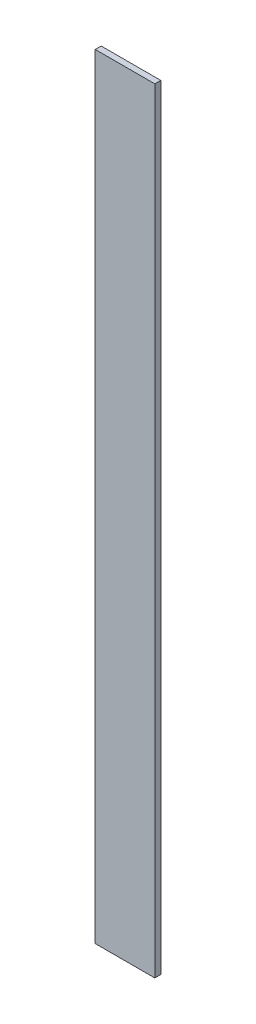
ISO-10303-21;
HEADER;
FILE_DESCRIPTION(('STEP AP214'),'2;1');
FILE_NAME('part.step','',(''),(''),'','','');
FILE_SCHEMA(('AUTOMOTIVE_DESIGN { 1 0 10303 214 1 1 1 1 }'));
ENDSEC;
DATA;
#1=APPLICATION_CONTEXT('core data for automotive mechanical design processes');
#2=APPLICATION_PROTOCOL_DEFINITION('international standard','automotive_design',2000,#1);
#3=PRODUCT_CONTEXT('',#1,'mechanical');
#4=PRODUCT('Part','Part','',(#3));
#5=PRODUCT_RELATED_PRODUCT_CATEGORY('part','',(#4));
#6=PRODUCT_DEFINITION_FORMATION('','',#4);
#7=PRODUCT_DEFINITION_CONTEXT('part definition',#1,'design');
#8=PRODUCT_DEFINITION('design','',#6,#7);
#9=PRODUCT_DEFINITION_SHAPE('','',#8);
#10=(LENGTH_UNIT() NAMED_UNIT(*) SI_UNIT(.MILLI.,.METRE.));
#11=(NAMED_UNIT(*) PLANE_ANGLE_UNIT() SI_UNIT($,.RADIAN.));
#12=(NAMED_UNIT(*) SI_UNIT($,.STERADIAN.) SOLID_ANGLE_UNIT());
#13=UNCERTAINTY_MEASURE_WITH_UNIT(LENGTH_MEASURE(1.E-05),#10,'distance_accuracy_value','');
#14=(GEOMETRIC_REPRESENTATION_CONTEXT(3) GLOBAL_UNCERTAINTY_ASSIGNED_CONTEXT((#13)) GLOBAL_UNIT_ASSIGNED_CONTEXT((#10,
#11,#12)) REPRESENTATION_CONTEXT('',''));
#15=CARTESIAN_POINT('',(0.,0.,0.));
#16=DIRECTION('',(0.,0.,1.));
#17=DIRECTION('',(1.,0.,0.));
#18=AXIS2_PLACEMENT_3D('',#15,#16,#17);
#19=CARTESIAN_POINT('',(-0.04999989999999,0.65000124,0.01));
#20=DIRECTION('',(0.,0.,-1.));
#21=DIRECTION('',(-1.,0.,0.));
#22=AXIS2_PLACEMENT_3D('',#19,#20,#21);
#23=PLANE('',#22);
#24=DIRECTION('',(1.,0.,0.));
#25=VECTOR('',#24,1.);
#26=CARTESIAN_POINT('',(-0.04999989999999,-0.6499987,0.01));
#27=LINE('',#26,#25);
#28=CARTESIAN_POINT('',(-0.04999989999999,-0.6499987,0.01));
#29=VERTEX_POINT('',#28);
#30=CARTESIAN_POINT('',(0.04999989999999,-0.6499987,0.01));
#31=VERTEX_POINT('',#30);
#32=EDGE_CURVE('E55',#29,#31,#27,.T.);
#33=ORIENTED_EDGE('',*,*,#32,.T.);
#34=DIRECTION('',(0.,1.,0.));
#35=VECTOR('',#34,1.);
#36=CARTESIAN_POINT('',(0.04999989999999,-0.6499987,0.01));
#37=LINE('',#36,#35);
#38=CARTESIAN_POINT('',(0.04999989999999,0.65000124,0.01));
#39=VERTEX_POINT('',#38);
#40=EDGE_CURVE('E57',#31,#39,#37,.T.);
#41=ORIENTED_EDGE('',*,*,#40,.T.);
#42=DIRECTION('',(1.,0.,0.));
#43=VECTOR('',#42,1.);
#44=CARTESIAN_POINT('',(0.04999989999999,0.65000124,0.01));
#45=LINE('',#44,#43);
#46=CARTESIAN_POINT('',(-0.04999989999999,0.65000124,0.01));
#47=VERTEX_POINT('',#46);
#48=EDGE_CURVE('E20',#39,#47,#45,.F.);
#49=ORIENTED_EDGE('',*,*,#48,.T.);
#50=DIRECTION('',(0.,1.,0.));
#51=VECTOR('',#50,1.);
#52=CARTESIAN_POINT('',(-0.04999989999999,0.65000124,0.01));
#53=LINE('',#52,#51);
#54=EDGE_CURVE('E80',#47,#29,#53,.F.);
#55=ORIENTED_EDGE('',*,*,#54,.T.);
#56=EDGE_LOOP('',(#33,#41,#49,#55));
#57=FACE_BOUND('',#56,.T.);
#58=ADVANCED_FACE('F17',(#57),#23,.F.);
#59=CARTESIAN_POINT('',(0.04999989999999,0.65000124,0.));
#60=DIRECTION('',(0.,-1.,0.));
#61=DIRECTION('',(0.,0.,-1.));
#62=AXIS2_PLACEMENT_3D('',#59,#60,#61);
#63=PLANE('',#62);
#64=DIRECTION('',(0.,0.,-1.));
#65=VECTOR('',#64,1.);
#66=CARTESIAN_POINT('',(-0.04999989999999,0.65000124,0.));
#67=LINE('',#66,#65);
#68=CARTESIAN_POINT('',(-0.04999989999999,0.65000124,0.));
#69=VERTEX_POINT('',#68);
#70=EDGE_CURVE('E68',#69,#47,#67,.F.);
#71=ORIENTED_EDGE('',*,*,#70,.T.);
#72=ORIENTED_EDGE('',*,*,#48,.F.);
#73=DIRECTION('',(0.,0.,1.));
#74=VECTOR('',#73,1.);
#75=CARTESIAN_POINT('',(0.04999989999999,0.65000124,0.));
#76=LINE('',#75,#74);
#77=CARTESIAN_POINT('',(0.04999989999999,0.65000124,0.));
#78=VERTEX_POINT('',#77);
#79=EDGE_CURVE('E63',#39,#78,#76,.F.);
#80=ORIENTED_EDGE('',*,*,#79,.T.);
#81=DIRECTION('',(-1.,0.,0.));
#82=VECTOR('',#81,1.);
#83=CARTESIAN_POINT('',(-0.04999989999999,0.65000124,0.));
#84=LINE('',#83,#82);
#85=EDGE_CURVE('E83',#69,#78,#84,.F.);
#86=ORIENTED_EDGE('',*,*,#85,.F.);
#87=EDGE_LOOP('',(#71,#72,#80,#86));
#88=FACE_BOUND('',#87,.T.);
#89=ADVANCED_FACE('F65',(#88),#63,.F.);
#90=CARTESIAN_POINT('',(0.04999989999999,-0.6499987,0.));
#91=DIRECTION('',(-1.,0.,0.));
#92=DIRECTION('',(0.,0.,1.));
#93=AXIS2_PLACEMENT_3D('',#90,#91,#92);
#94=PLANE('',#93);
#95=ORIENTED_EDGE('',*,*,#79,.F.);
#96=ORIENTED_EDGE('',*,*,#40,.F.);
#97=DIRECTION('',(0.,0.,1.));
#98=VECTOR('',#97,1.);
#99=CARTESIAN_POINT('',(0.04999989999999,-0.6499987,0.));
#100=LINE('',#99,#98);
#101=CARTESIAN_POINT('',(0.04999989999999,-0.6499987,0.));
#102=VERTEX_POINT('',#101);
#103=EDGE_CURVE('E75',#31,#102,#100,.F.);
#104=ORIENTED_EDGE('',*,*,#103,.T.);
#105=DIRECTION('',(0.,1.,0.));
#106=VECTOR('',#105,1.);
#107=CARTESIAN_POINT('',(0.04999989999999,0.65000124,0.));
#108=LINE('',#107,#106);
#109=EDGE_CURVE('E72',#78,#102,#108,.F.);
#110=ORIENTED_EDGE('',*,*,#109,.F.);
#111=EDGE_LOOP('',(#95,#96,#104,#110));
#112=FACE_BOUND('',#111,.T.);
#113=ADVANCED_FACE('F70',(#112),#94,.F.);
#114=CARTESIAN_POINT('',(-0.04999989999999,-0.6499987,0.));
#115=DIRECTION('',(0.,1.,0.));
#116=DIRECTION('',(0.,0.,1.));
#117=AXIS2_PLACEMENT_3D('',#114,#115,#116);
#118=PLANE('',#117);
#119=ORIENTED_EDGE('',*,*,#103,.F.);
#120=ORIENTED_EDGE('',*,*,#32,.F.);
#121=DIRECTION('',(0.,0.,-1.));
#122=VECTOR('',#121,1.);
#123=CARTESIAN_POINT('',(-0.04999989999999,-0.6499987,0.));
#124=LINE('',#123,#122);
#125=CARTESIAN_POINT('',(-0.04999989999999,-0.6499987,0.));
#126=VERTEX_POINT('',#125);
#127=EDGE_CURVE('E35',#29,#126,#124,.T.);
#128=ORIENTED_EDGE('',*,*,#127,.T.);
#129=DIRECTION('',(-1.,0.,0.));
#130=VECTOR('',#129,1.);
#131=CARTESIAN_POINT('',(-0.04999989999999,-0.6499987,0.));
#132=LINE('',#131,#130);
#133=EDGE_CURVE('E26',#102,#126,#132,.T.);
#134=ORIENTED_EDGE('',*,*,#133,.F.);
#135=EDGE_LOOP('',(#119,#120,#128,#134));
#136=FACE_BOUND('',#135,.T.);
#137=ADVANCED_FACE('F89',(#136),#118,.F.);
#138=CARTESIAN_POINT('',(-0.04999989999999,0.65000124,0.));
#139=DIRECTION('',(1.,0.,0.));
#140=DIRECTION('',(0.,0.,-1.));
#141=AXIS2_PLACEMENT_3D('',#138,#139,#140);
#142=PLANE('',#141);
#143=ORIENTED_EDGE('',*,*,#127,.F.);
#144=ORIENTED_EDGE('',*,*,#54,.F.);
#145=ORIENTED_EDGE('',*,*,#70,.F.);
#146=DIRECTION('',(0.,1.,0.));
#147=VECTOR('',#146,1.);
#148=CARTESIAN_POINT('',(-0.04999989999999,0.65000124,0.));
#149=LINE('',#148,#147);
#150=EDGE_CURVE('E11',#126,#69,#149,.T.);
#151=ORIENTED_EDGE('',*,*,#150,.F.);
#152=EDGE_LOOP('',(#143,#144,#145,#151));
#153=FACE_BOUND('',#152,.T.);
#154=ADVANCED_FACE('F91',(#153),#142,.F.);
#155=CARTESIAN_POINT('',(-0.04999989999999,0.65000124,0.));
#156=DIRECTION('',(0.,0.,-1.));
#157=DIRECTION('',(-1.,0.,0.));
#158=AXIS2_PLACEMENT_3D('',#155,#156,#157);
#159=PLANE('',#158);
#160=ORIENTED_EDGE('',*,*,#133,.T.);
#161=ORIENTED_EDGE('',*,*,#150,.T.);
#162=ORIENTED_EDGE('',*,*,#85,.T.);
#163=ORIENTED_EDGE('',*,*,#109,.T.);
#164=EDGE_LOOP('',(#160,#161,#162,#163));
#165=FACE_BOUND('',#164,.T.);
#166=ADVANCED_FACE('F88',(#165),#159,.T.);
#167=CLOSED_SHELL('',(#58,#89,#113,#137,#154,#166));
#168=MANIFOLD_SOLID_BREP('B1',#167);
#169=ADVANCED_BREP_SHAPE_REPRESENTATION('',(#18,#168),#14);
#170=SHAPE_DEFINITION_REPRESENTATION(#9,#169);
ENDSEC;
END-ISO-10303-21;
